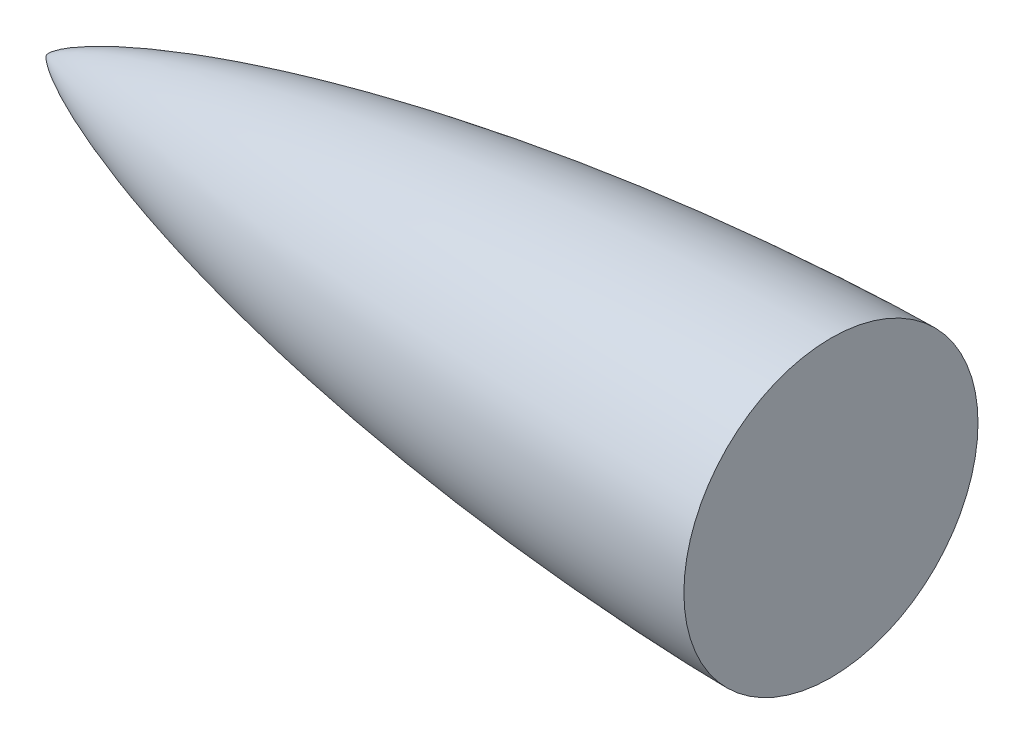
ISO-10303-21;
HEADER;
FILE_DESCRIPTION(('STEP AP214'),'2;1');
FILE_NAME('part.step','',(''),(''),'','','');
FILE_SCHEMA(('AUTOMOTIVE_DESIGN { 1 0 10303 214 1 1 1 1 }'));
ENDSEC;
DATA;
#1=APPLICATION_CONTEXT('core data for automotive mechanical design processes');
#2=APPLICATION_PROTOCOL_DEFINITION('international standard','automotive_design',2000,#1);
#3=PRODUCT_CONTEXT('',#1,'mechanical');
#4=PRODUCT('Part','Part','',(#3));
#5=PRODUCT_RELATED_PRODUCT_CATEGORY('part','',(#4));
#6=PRODUCT_DEFINITION_FORMATION('','',#4);
#7=PRODUCT_DEFINITION_CONTEXT('part definition',#1,'design');
#8=PRODUCT_DEFINITION('design','',#6,#7);
#9=PRODUCT_DEFINITION_SHAPE('','',#8);
#10=(LENGTH_UNIT() NAMED_UNIT(*) SI_UNIT(.MILLI.,.METRE.));
#11=(NAMED_UNIT(*) PLANE_ANGLE_UNIT() SI_UNIT($,.RADIAN.));
#12=(NAMED_UNIT(*) SI_UNIT($,.STERADIAN.) SOLID_ANGLE_UNIT());
#13=UNCERTAINTY_MEASURE_WITH_UNIT(LENGTH_MEASURE(1.E-05),#10,'distance_accuracy_value','');
#14=(GEOMETRIC_REPRESENTATION_CONTEXT(3) GLOBAL_UNCERTAINTY_ASSIGNED_CONTEXT((#13)) GLOBAL_UNIT_ASSIGNED_CONTEXT((#10,
#11,#12)) REPRESENTATION_CONTEXT('',''));
#15=CARTESIAN_POINT('',(0.,0.,0.));
#16=DIRECTION('',(0.,0.,1.));
#17=DIRECTION('',(1.,0.,0.));
#18=AXIS2_PLACEMENT_3D('',#15,#16,#17);
#19=CARTESIAN_POINT('',(16.,0.,0.));
#20=DIRECTION('',(-1.,0.,0.));
#21=DIRECTION('',(0.,0.,1.));
#22=AXIS2_PLACEMENT_3D('',#19,#20,#21);
#23=PLANE('',#22);
#24=CARTESIAN_POINT('',(16.,0.,0.));
#25=DIRECTION('',(-1.,0.,0.));
#26=DIRECTION('',(0.,0.,1.));
#27=AXIS2_PLACEMENT_3D('',#24,#25,#26);
#28=CIRCLE('',#27,3.);
#29=CARTESIAN_POINT('',(16.,0.,3.));
#30=VERTEX_POINT('',#29);
#31=EDGE_CURVE('E11',#30,#30,#28,.T.);
#32=ORIENTED_EDGE('',*,*,#31,.F.);
#33=EDGE_LOOP('',(#32));
#34=FACE_BOUND('',#33,.T.);
#35=ADVANCED_FACE('F39',(#34),#23,.F.);
#36=CARTESIAN_POINT('',(16.,3.,0.));
#37=CARTESIAN_POINT('',(15.7511853546781,2.99874549928009,0.));
#38=CARTESIAN_POINT('',(15.2454054047244,2.98868482721593,0.));
#39=CARTESIAN_POINT('',(14.4828967080501,2.96332273583955,0.));
#40=CARTESIAN_POINT('',(13.4642347635389,2.91132139647593,0.));
#41=CARTESIAN_POINT('',(12.4383682552463,2.84206250287842,0.));
#42=CARTESIAN_POINT('',(11.4137798595076,2.75584428647548,0.));
#43=CARTESIAN_POINT('',(10.390773835545,2.65256088728223,0.));
#44=CARTESIAN_POINT('',(9.36969741257307,2.53161439290481,0.));
#45=CARTESIAN_POINT('',(8.35096063965537,2.39231380258654,0.));
#46=CARTESIAN_POINT('',(7.33505050104021,2.2336376423668,0.));
#47=CARTESIAN_POINT('',(6.32258032772662,2.05427491043916,0.));
#48=CARTESIAN_POINT('',(5.31432697809244,1.85244678462087,0.));
#49=CARTESIAN_POINT('',(4.31137477979257,1.62565009757063,0.));
#50=CARTESIAN_POINT('',(3.31526030508024,1.37027188738713,0.));
#51=CARTESIAN_POINT('',(2.41241296486042,1.10507254508401,0.));
#52=CARTESIAN_POINT('',(1.64334190571857,0.845012811156997,0.));
#53=CARTESIAN_POINT('',(1.05210032608994,0.613030956930588,0.));
#54=CARTESIAN_POINT('',(0.658856664353206,0.435798153704205,0.));
#55=CARTESIAN_POINT('',(0.397017382490043,0.299858916664289,0.));
#56=CARTESIAN_POINT('',(0.236507893002554,0.204146545581397,0.));
#57=CARTESIAN_POINT('',(0.138407276730496,0.136894154089458,0.));
#58=CARTESIAN_POINT('',(0.0809188268317412,0.0915913532391066,0.));
#59=CARTESIAN_POINT('',(0.0476174548062445,0.0615939853310325,0.));
#60=CARTESIAN_POINT('',(0.0284089017440012,0.0417773493022093,0.));
#61=CARTESIAN_POINT('',(0.0169284113674655,0.0283742391730636,0.));
#62=CARTESIAN_POINT('',(0.00860638364556625,0.0171816386045917,0.));
#63=CARTESIAN_POINT('',(0.003631848474751,0.0096504325912683,0.));
#64=CARTESIAN_POINT('',(0.00109686320056562,0.00377909606262983,0.));
#65=CARTESIAN_POINT('',(0.,0.,0.));
#66=B_SPLINE_CURVE_WITH_KNOTS('',4,(#36,#37,#38,#39,#40,#41,#42,#43,#44,#45,#46,#47,#48,#49,#50,
#51,#52,#53,#54,#55,#56,#57,#58,#59,#60,#61,#62,#63,#64,#65),.UNSPECIFIED.,.F.,.F.,(5,1,1,1,1,1,
1,1,1,1,1,1,1,1,1,1,1,1,1,1,1,1,1,1,1,1,5),(0.,0.0605597225351813,0.123121420336128,
0.185683118460354,0.248244815044222,0.310806513181537,0.373368212036148,0.435929907452966,
0.498491604357003,0.561053304390292,0.623614997108699,0.686176701500184,0.748738393278478,
0.81130008073362,0.873861778467724,0.915152417417069,0.946266276100841,0.965827377474264,
0.978797778294365,0.986921873655179,0.991724157646963,0.994756173718793,0.996600759614445,
0.997821861998986,0.998438435832056,0.99904578705638,1.),.UNSPECIFIED.);
#67=CARTESIAN_POINT('',(0.,0.,0.));
#68=DIRECTION('',(-1.,0.,0.));
#69=AXIS1_PLACEMENT('',#67,#68);
#70=SURFACE_OF_REVOLUTION('',#66,#69);
#71=CARTESIAN_POINT('',(0.,0.,0.));
#72=VERTEX_POINT('',#71);
#73=VERTEX_LOOP('',#72);
#74=FACE_BOUND('',#73,.T.);
#75=ORIENTED_EDGE('',*,*,#31,.T.);
#76=EDGE_LOOP('',(#75));
#77=FACE_BOUND('',#76,.T.);
#78=ADVANCED_FACE('F48',(#74,#77),#70,.T.);
#79=CLOSED_SHELL('',(#35,#78));
#80=MANIFOLD_SOLID_BREP('B2',#79);
#81=ADVANCED_BREP_SHAPE_REPRESENTATION('',(#18,#80),#14);
#82=SHAPE_DEFINITION_REPRESENTATION(#9,#81);
ENDSEC;
END-ISO-10303-21;
